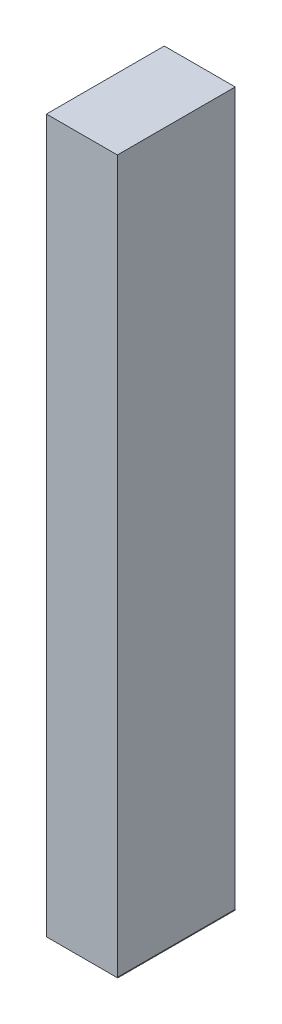
ISO-10303-21;
HEADER;
FILE_DESCRIPTION(('STEP AP214'),'2;1');
FILE_NAME('part.step','',(''),(''),'','','');
FILE_SCHEMA(('AUTOMOTIVE_DESIGN { 1 0 10303 214 1 1 1 1 }'));
ENDSEC;
DATA;
#1=APPLICATION_CONTEXT('core data for automotive mechanical design processes');
#2=APPLICATION_PROTOCOL_DEFINITION('international standard','automotive_design',2000,#1);
#3=PRODUCT_CONTEXT('',#1,'mechanical');
#4=PRODUCT('Part','Part','',(#3));
#5=PRODUCT_RELATED_PRODUCT_CATEGORY('part','',(#4));
#6=PRODUCT_DEFINITION_FORMATION('','',#4);
#7=PRODUCT_DEFINITION_CONTEXT('part definition',#1,'design');
#8=PRODUCT_DEFINITION('design','',#6,#7);
#9=PRODUCT_DEFINITION_SHAPE('','',#8);
#10=(LENGTH_UNIT() NAMED_UNIT(*) SI_UNIT(.MILLI.,.METRE.));
#11=(NAMED_UNIT(*) PLANE_ANGLE_UNIT() SI_UNIT($,.RADIAN.));
#12=(NAMED_UNIT(*) SI_UNIT($,.STERADIAN.) SOLID_ANGLE_UNIT());
#13=UNCERTAINTY_MEASURE_WITH_UNIT(LENGTH_MEASURE(1.E-05),#10,'distance_accuracy_value','');
#14=(GEOMETRIC_REPRESENTATION_CONTEXT(3) GLOBAL_UNCERTAINTY_ASSIGNED_CONTEXT((#13)) GLOBAL_UNIT_ASSIGNED_CONTEXT((#10,
#11,#12)) REPRESENTATION_CONTEXT('',''));
#15=CARTESIAN_POINT('',(0.,0.,0.));
#16=DIRECTION('',(0.,0.,1.));
#17=DIRECTION('',(1.,0.,0.));
#18=AXIS2_PLACEMENT_3D('',#15,#16,#17);
#19=CARTESIAN_POINT('',(2.54,-25.4,0.));
#20=DIRECTION('',(-0.707106781187048,-0.707106781186048,0.));
#21=DIRECTION('',(0.707106781186048,-0.707106781187048,0.));
#22=AXIS2_PLACEMENT_3D('',#19,#20,#21);
#23=PLANE('',#22);
#24=DIRECTION('',(0.,0.,1.));
#25=VECTOR('',#24,1.);
#26=CARTESIAN_POINT('',(2.5146,-25.3746,0.));
#27=LINE('',#26,#25);
#28=CARTESIAN_POINT('',(2.51460000000001,-25.3746,0.));
#29=VERTEX_POINT('',#28);
#30=CARTESIAN_POINT('',(2.51460000000001,-25.3746,8.40000098));
#31=VERTEX_POINT('',#30);
#32=EDGE_CURVE('E74',#29,#31,#27,.T.);
#33=ORIENTED_EDGE('',*,*,#32,.T.);
#34=DIRECTION('',(-0.707106781186572,0.707106781186523,0.));
#35=VECTOR('',#34,1.);
#36=CARTESIAN_POINT('',(2.54,-25.4,8.40000098));
#37=LINE('',#36,#35);
#38=CARTESIAN_POINT('',(2.54,-25.4,8.40000098));
#39=VERTEX_POINT('',#38);
#40=EDGE_CURVE('E63',#39,#31,#37,.T.);
#41=ORIENTED_EDGE('',*,*,#40,.F.);
#42=DIRECTION('',(0.,0.,1.));
#43=VECTOR('',#42,1.);
#44=CARTESIAN_POINT('',(2.54,-25.4,0.));
#45=LINE('',#44,#43);
#46=CARTESIAN_POINT('',(2.54,-25.4,0.));
#47=VERTEX_POINT('',#46);
#48=EDGE_CURVE('E86',#39,#47,#45,.F.);
#49=ORIENTED_EDGE('',*,*,#48,.T.);
#50=DIRECTION('',(0.707106781186048,-0.707106781187048,0.));
#51=VECTOR('',#50,1.);
#52=CARTESIAN_POINT('',(2.54,-25.4,0.));
#53=LINE('',#52,#51);
#54=EDGE_CURVE('E20',#29,#47,#53,.T.);
#55=ORIENTED_EDGE('',*,*,#54,.F.);
#56=EDGE_LOOP('',(#33,#41,#49,#55));
#57=FACE_BOUND('',#56,.T.);
#58=ADVANCED_FACE('F17',(#57),#23,.F.);
#59=CARTESIAN_POINT('',(2.5146,-25.3746,0.));
#60=DIRECTION('',(-1.,0.,0.));
#61=DIRECTION('',(0.,0.,1.));
#62=AXIS2_PLACEMENT_3D('',#59,#60,#61);
#63=PLANE('',#62);
#64=DIRECTION('',(0.,0.,-1.));
#65=VECTOR('',#64,1.);
#66=CARTESIAN_POINT('',(2.5146,25.4,0.));
#67=LINE('',#66,#65);
#68=CARTESIAN_POINT('',(2.5146,25.4,0.));
#69=VERTEX_POINT('',#68);
#70=CARTESIAN_POINT('',(2.5146,25.4,8.40000098));
#71=VERTEX_POINT('',#70);
#72=EDGE_CURVE('E71',#69,#71,#67,.F.);
#73=ORIENTED_EDGE('',*,*,#72,.T.);
#74=DIRECTION('',(0.,1.,0.));
#75=VECTOR('',#74,1.);
#76=CARTESIAN_POINT('',(2.5146,-25.4,8.40000098));
#77=LINE('',#76,#75);
#78=EDGE_CURVE('E60',#31,#71,#77,.T.);
#79=ORIENTED_EDGE('',*,*,#78,.F.);
#80=ORIENTED_EDGE('',*,*,#32,.F.);
#81=DIRECTION('',(0.,1.,0.));
#82=VECTOR('',#81,1.);
#83=CARTESIAN_POINT('',(2.5146,-25.4,0.));
#84=LINE('',#83,#82);
#85=EDGE_CURVE('E88',#29,#69,#84,.T.);
#86=ORIENTED_EDGE('',*,*,#85,.T.);
#87=EDGE_LOOP('',(#73,#79,#80,#86));
#88=FACE_BOUND('',#87,.T.);
#89=ADVANCED_FACE('F78',(#88),#63,.F.);
#90=CARTESIAN_POINT('',(2.5146,25.4,0.));
#91=DIRECTION('',(0.,-1.,0.));
#92=DIRECTION('',(0.,0.,-1.));
#93=AXIS2_PLACEMENT_3D('',#90,#91,#92);
#94=PLANE('',#93);
#95=DIRECTION('',(0.,0.,-1.));
#96=VECTOR('',#95,1.);
#97=CARTESIAN_POINT('',(-2.54,25.4,0.));
#98=LINE('',#97,#96);
#99=CARTESIAN_POINT('',(-2.54,25.4,0.));
#100=VERTEX_POINT('',#99);
#101=CARTESIAN_POINT('',(-2.54,25.4,8.40000098));
#102=VERTEX_POINT('',#101);
#103=EDGE_CURVE('E94',#100,#102,#98,.F.);
#104=ORIENTED_EDGE('',*,*,#103,.T.);
#105=DIRECTION('',(1.,0.,0.));
#106=VECTOR('',#105,1.);
#107=CARTESIAN_POINT('',(2.54,25.4,8.40000098));
#108=LINE('',#107,#106);
#109=EDGE_CURVE('E80',#71,#102,#108,.F.);
#110=ORIENTED_EDGE('',*,*,#109,.F.);
#111=ORIENTED_EDGE('',*,*,#72,.F.);
#112=DIRECTION('',(1.,0.,0.));
#113=VECTOR('',#112,1.);
#114=CARTESIAN_POINT('',(2.54,25.4,0.));
#115=LINE('',#114,#113);
#116=EDGE_CURVE('E90',#69,#100,#115,.F.);
#117=ORIENTED_EDGE('',*,*,#116,.T.);
#118=EDGE_LOOP('',(#104,#110,#111,#117));
#119=FACE_BOUND('',#118,.T.);
#120=ADVANCED_FACE('F107',(#119),#94,.F.);
#121=CARTESIAN_POINT('',(2.54,-25.4,8.40000098));
#122=DIRECTION('',(0.,0.,1.));
#123=DIRECTION('',(1.,0.,0.));
#124=AXIS2_PLACEMENT_3D('',#121,#122,#123);
#125=PLANE('',#124);
#126=DIRECTION('',(0.,1.,0.));
#127=VECTOR('',#126,1.);
#128=CARTESIAN_POINT('',(-2.54,25.4,8.40000098));
#129=LINE('',#128,#127);
#130=CARTESIAN_POINT('',(-2.54,-25.4,8.40000098));
#131=VERTEX_POINT('',#130);
#132=EDGE_CURVE('E97',#102,#131,#129,.F.);
#133=ORIENTED_EDGE('',*,*,#132,.T.);
#134=DIRECTION('',(1.,0.,0.));
#135=VECTOR('',#134,1.);
#136=CARTESIAN_POINT('',(-2.54,-25.4,8.40000098));
#137=LINE('',#136,#135);
#138=EDGE_CURVE('E67',#131,#39,#137,.T.);
#139=ORIENTED_EDGE('',*,*,#138,.T.);
#140=ORIENTED_EDGE('',*,*,#40,.T.);
#141=ORIENTED_EDGE('',*,*,#78,.T.);
#142=ORIENTED_EDGE('',*,*,#109,.T.);
#143=EDGE_LOOP('',(#133,#139,#140,#141,#142));
#144=FACE_BOUND('',#143,.T.);
#145=ADVANCED_FACE('F66',(#144),#125,.T.);
#146=CARTESIAN_POINT('',(-2.54,-25.4,0.));
#147=DIRECTION('',(0.,1.,0.));
#148=DIRECTION('',(0.,0.,1.));
#149=AXIS2_PLACEMENT_3D('',#146,#147,#148);
#150=PLANE('',#149);
#151=ORIENTED_EDGE('',*,*,#48,.F.);
#152=ORIENTED_EDGE('',*,*,#138,.F.);
#153=DIRECTION('',(0.,0.,-1.));
#154=VECTOR('',#153,1.);
#155=CARTESIAN_POINT('',(-2.54,-25.4,0.));
#156=LINE('',#155,#154);
#157=CARTESIAN_POINT('',(-2.54,-25.4,0.));
#158=VERTEX_POINT('',#157);
#159=EDGE_CURVE('E26',#131,#158,#156,.T.);
#160=ORIENTED_EDGE('',*,*,#159,.T.);
#161=DIRECTION('',(1.,0.,0.));
#162=VECTOR('',#161,1.);
#163=CARTESIAN_POINT('',(2.54,-25.4,0.));
#164=LINE('',#163,#162);
#165=EDGE_CURVE('E34',#158,#47,#164,.T.);
#166=ORIENTED_EDGE('',*,*,#165,.T.);
#167=EDGE_LOOP('',(#151,#152,#160,#166));
#168=FACE_BOUND('',#167,.T.);
#169=ADVANCED_FACE('F102',(#168),#150,.F.);
#170=CARTESIAN_POINT('',(2.54,-25.4,0.));
#171=DIRECTION('',(0.,0.,1.));
#172=DIRECTION('',(1.,0.,0.));
#173=AXIS2_PLACEMENT_3D('',#170,#171,#172);
#174=PLANE('',#173);
#175=DIRECTION('',(0.,1.,0.));
#176=VECTOR('',#175,1.);
#177=CARTESIAN_POINT('',(-2.54,25.4,0.));
#178=LINE('',#177,#176);
#179=EDGE_CURVE('E11',#158,#100,#178,.T.);
#180=ORIENTED_EDGE('',*,*,#179,.T.);
#181=ORIENTED_EDGE('',*,*,#116,.F.);
#182=ORIENTED_EDGE('',*,*,#85,.F.);
#183=ORIENTED_EDGE('',*,*,#54,.T.);
#184=ORIENTED_EDGE('',*,*,#165,.F.);
#185=EDGE_LOOP('',(#180,#181,#182,#183,#184));
#186=FACE_BOUND('',#185,.T.);
#187=ADVANCED_FACE('F109',(#186),#174,.F.);
#188=CARTESIAN_POINT('',(-2.54,25.4,0.));
#189=DIRECTION('',(1.,0.,0.));
#190=DIRECTION('',(0.,0.,-1.));
#191=AXIS2_PLACEMENT_3D('',#188,#189,#190);
#192=PLANE('',#191);
#193=ORIENTED_EDGE('',*,*,#159,.F.);
#194=ORIENTED_EDGE('',*,*,#132,.F.);
#195=ORIENTED_EDGE('',*,*,#103,.F.);
#196=ORIENTED_EDGE('',*,*,#179,.F.);
#197=EDGE_LOOP('',(#193,#194,#195,#196));
#198=FACE_BOUND('',#197,.T.);
#199=ADVANCED_FACE('F105',(#198),#192,.F.);
#200=CLOSED_SHELL('',(#58,#89,#120,#145,#169,#187,#199));
#201=MANIFOLD_SOLID_BREP('B1',#200);
#202=ADVANCED_BREP_SHAPE_REPRESENTATION('',(#18,#201),#14);
#203=SHAPE_DEFINITION_REPRESENTATION(#9,#202);
ENDSEC;
END-ISO-10303-21;
